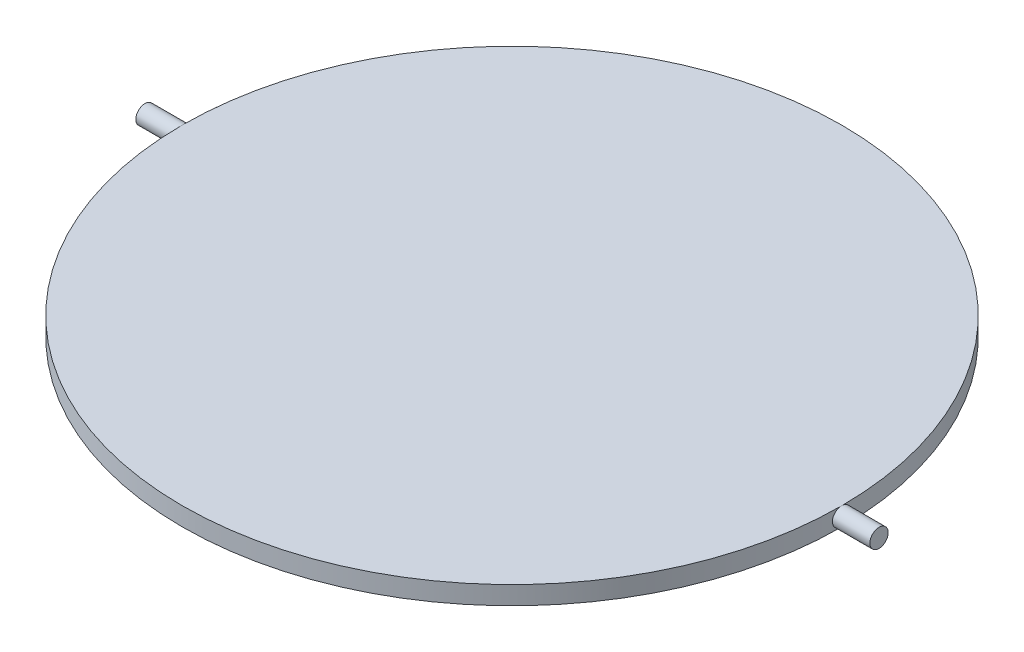
ISO-10303-21;
HEADER;
FILE_DESCRIPTION(('STEP AP214'),'2;1');
FILE_NAME('part.step','',(''),(''),'','','');
FILE_SCHEMA(('AUTOMOTIVE_DESIGN { 1 0 10303 214 1 1 1 1 }'));
ENDSEC;
DATA;
#1=APPLICATION_CONTEXT('core data for automotive mechanical design processes');
#2=APPLICATION_PROTOCOL_DEFINITION('international standard','automotive_design',2000,#1);
#3=PRODUCT_CONTEXT('',#1,'mechanical');
#4=PRODUCT('Part','Part','',(#3));
#5=PRODUCT_RELATED_PRODUCT_CATEGORY('part','',(#4));
#6=PRODUCT_DEFINITION_FORMATION('','',#4);
#7=PRODUCT_DEFINITION_CONTEXT('part definition',#1,'design');
#8=PRODUCT_DEFINITION('design','',#6,#7);
#9=PRODUCT_DEFINITION_SHAPE('','',#8);
#10=(LENGTH_UNIT() NAMED_UNIT(*) SI_UNIT(.MILLI.,.METRE.));
#11=(NAMED_UNIT(*) PLANE_ANGLE_UNIT() SI_UNIT($,.RADIAN.));
#12=(NAMED_UNIT(*) SI_UNIT($,.STERADIAN.) SOLID_ANGLE_UNIT());
#13=UNCERTAINTY_MEASURE_WITH_UNIT(LENGTH_MEASURE(1.E-05),#10,'distance_accuracy_value','');
#14=(GEOMETRIC_REPRESENTATION_CONTEXT(3) GLOBAL_UNCERTAINTY_ASSIGNED_CONTEXT((#13)) GLOBAL_UNIT_ASSIGNED_CONTEXT((#10,
#11,#12)) REPRESENTATION_CONTEXT('',''));
#15=CARTESIAN_POINT('',(0.,0.,0.));
#16=DIRECTION('',(0.,0.,1.));
#17=DIRECTION('',(1.,0.,0.));
#18=AXIS2_PLACEMENT_3D('',#15,#16,#17);
#19=CARTESIAN_POINT('',(0.,0.75,0.));
#20=DIRECTION('',(0.,-1.,0.));
#21=DIRECTION('',(0.,0.,-1.));
#22=AXIS2_PLACEMENT_3D('',#19,#20,#21);
#23=CYLINDRICAL_SURFACE('',#22,26.95);
#24=CARTESIAN_POINT('',(-26.95,0.75,0.));
#25=CARTESIAN_POINT('',(-26.9499998593243,0.749998134870513,-0.0421190802417795));
#26=CARTESIAN_POINT('',(-26.9499002012764,0.74644005737712,-0.0842684931730713));
#27=CARTESIAN_POINT('',(-26.9495122260496,0.732295891268877,-0.167405902207209));
#28=CARTESIAN_POINT('',(-26.9492236832813,0.721701398680808,-0.208392448323906));
#29=CARTESIAN_POINT('',(-26.9484906167634,0.693786775159977,-0.287987679115359));
#30=CARTESIAN_POINT('',(-26.9480461690774,0.676469923524798,-0.326597512573474));
#31=CARTESIAN_POINT('',(-26.9470514315303,0.635606819625647,-0.400351330224189));
#32=CARTESIAN_POINT('',(-26.9465011675827,0.612062091986949,-0.435496159786014));
#33=CARTESIAN_POINT('',(-26.945356507194,0.55940008710365,-0.501347670905925));
#34=CARTESIAN_POINT('',(-26.9447620955323,0.530280882468651,-0.532052810965241));
#35=CARTESIAN_POINT('',(-26.9435962684163,0.467299770399804,-0.588140404970217));
#36=CARTESIAN_POINT('',(-26.9430248538768,0.433437674539571,-0.613522647346801));
#37=CARTESIAN_POINT('',(-26.9419693891428,0.361926751194656,-0.65824597559877));
#38=CARTESIAN_POINT('',(-26.9414853515205,0.324277379991711,-0.677586192412789));
#39=CARTESIAN_POINT('',(-26.9406593539721,0.246264521724114,-0.709670791129391));
#40=CARTESIAN_POINT('',(-26.9403173935157,0.205901044788916,-0.722415197646991));
#41=CARTESIAN_POINT('',(-26.9398142141102,0.123616869284261,-0.740943249359809));
#42=CARTESIAN_POINT('',(-26.9396529480854,0.0816965792477881,-0.746728707575131));
#43=CARTESIAN_POINT('',(-26.9395291991567,-0.00252049162701276,-0.751180217276151));
#44=CARTESIAN_POINT('',(-26.93956671552,-0.0448172710768847,-0.749846295006582));
#45=CARTESIAN_POINT('',(-26.9398362568672,-0.128574368679873,-0.740098448732348));
#46=CARTESIAN_POINT('',(-26.9400682279573,-0.170034915337394,-0.731686486426101));
#47=CARTESIAN_POINT('',(-26.9407004435226,-0.250955140417738,-0.708024377933586));
#48=CARTESIAN_POINT('',(-26.9411006883413,-0.290414814754905,-0.692774217784773));
#49=CARTESIAN_POINT('',(-26.9420243935563,-0.366219476100302,-0.65586636002275));
#50=CARTESIAN_POINT('',(-26.9425478712455,-0.402564024997558,-0.634207763028314));
#51=CARTESIAN_POINT('',(-26.9436590114613,-0.471101931828154,-0.58509851346002));
#52=CARTESIAN_POINT('',(-26.9442466741105,-0.503295281833247,-0.557647849824334));
#53=CARTESIAN_POINT('',(-26.9454201761372,-0.562628370336979,-0.497722591274507));
#54=CARTESIAN_POINT('',(-26.9460060148283,-0.589766390209923,-0.465246294674824));
#55=CARTESIAN_POINT('',(-26.947109633733,-0.638205233371934,-0.396197662688473));
#56=CARTESIAN_POINT('',(-26.947627413936,-0.659506055744256,-0.359625326658515));
#57=CARTESIAN_POINT('',(-26.9485365530528,-0.695665651667148,-0.283421828246701));
#58=CARTESIAN_POINT('',(-26.9489279109162,-0.710524371694971,-0.243790640454293));
#59=CARTESIAN_POINT('',(-26.9495400712508,-0.733376879942729,-0.162594860663954));
#60=CARTESIAN_POINT('',(-26.9497608741226,-0.741370684285609,-0.121030273207049));
#61=CARTESIAN_POINT('',(-26.9500069829467,-0.750264339995218,-0.0371625032931079));
#62=CARTESIAN_POINT('',(-26.9500323544294,-0.751166569254376,0.00514042681967611));
#63=CARTESIAN_POINT('',(-26.9498849139846,-0.745857659629728,0.0892971617452533));
#64=CARTESIAN_POINT('',(-26.9497121022535,-0.739646527793599,0.131150967002983));
#65=CARTESIAN_POINT('',(-26.9491878147197,-0.720289176335919,0.213214739548595));
#66=CARTESIAN_POINT('',(-26.9488363667184,-0.707144035849203,0.253424961577245));
#67=CARTESIAN_POINT('',(-26.9479944123676,-0.674292907708763,0.331067956235496));
#68=CARTESIAN_POINT('',(-26.9475039057801,-0.654586908829557,0.368500724112801));
#69=CARTESIAN_POINT('',(-26.9464389334773,-0.609167323663443,0.439537171027309));
#70=CARTESIAN_POINT('',(-26.9458644454068,-0.583452136692138,0.473139826272216));
#71=CARTESIAN_POINT('',(-26.9446963327876,-0.526746488351254,0.535551907089267));
#72=CARTESIAN_POINT('',(-26.9441027081956,-0.495756015088144,0.564361321854397));
#73=CARTESIAN_POINT('',(-26.9429630579365,-0.429369318250322,0.616377056341489));
#74=CARTESIAN_POINT('',(-26.9424170453299,-0.393971892222208,0.639581841719475));
#75=CARTESIAN_POINT('',(-26.9414343850531,-0.319782245784351,0.679719121093234));
#76=CARTESIAN_POINT('',(-26.9409977371548,-0.280990032457287,0.696651628174721));
#77=CARTESIAN_POINT('',(-26.9402831303949,-0.201117764830667,0.723761013219886));
#78=CARTESIAN_POINT('',(-26.9400051481805,-0.160038048190896,0.733938885389289));
#79=CARTESIAN_POINT('',(-26.9396391487902,-0.0767520810613884,0.747253348822292));
#80=CARTESIAN_POINT('',(-26.9395511315184,-0.0345458311409473,0.750389943644144));
#81=CARTESIAN_POINT('',(-26.9395749942054,0.0497797348292769,0.749532697154204));
#82=CARTESIAN_POINT('',(-26.939686806272,0.0918990755392621,0.745541277592043));
#83=CARTESIAN_POINT('',(-26.9400975801237,0.174869592340975,0.730546280053982));
#84=CARTESIAN_POINT('',(-26.9403965422806,0.215720765912772,0.719542688145376));
#85=CARTESIAN_POINT('',(-26.9411479045594,0.294996354264111,0.69083599262062));
#86=CARTESIAN_POINT('',(-26.9416003073071,0.333420727499004,0.673132774349122));
#87=CARTESIAN_POINT('',(-26.942607530152,0.406751054824806,0.631530298116576));
#88=CARTESIAN_POINT('',(-26.943162346501,0.44165713760727,0.60763126689945));
#89=CARTESIAN_POINT('',(-26.9443120344167,0.506970900716467,0.554308854211107));
#90=CARTESIAN_POINT('',(-26.9449069152961,0.53737752989225,0.524884185486053));
#91=CARTESIAN_POINT('',(-26.9460697277803,0.592827560172211,0.461339143359118));
#92=CARTESIAN_POINT('',(-26.9466376526722,0.617869630709498,0.427217608436631));
#93=CARTESIAN_POINT('',(-26.9476827136046,0.661883370893273,0.355235109991873));
#94=CARTESIAN_POINT('',(-26.9481597927451,0.680851241076937,0.317371825272664));
#95=CARTESIAN_POINT('',(-26.9489683435096,0.7121388261713,0.239026125557905));
#96=CARTESIAN_POINT('',(-26.9492999888072,0.724466474708119,0.198546901127602));
#97=CARTESIAN_POINT('',(-26.9496915938785,0.738854139220878,0.131509714418074));
#98=CARTESIAN_POINT('',(-26.9498067448664,0.743028583802507,0.105386943856878));
#99=CARTESIAN_POINT('',(-26.9499609920539,0.748602099017646,0.0528467632648512));
#100=CARTESIAN_POINT('',(-26.9500000882727,0.750001170352389,0.0264293533084662));
#101=CARTESIAN_POINT('',(-26.95,0.75,0.));
#102=B_SPLINE_CURVE_WITH_KNOTS('',3,(#24,#25,#26,#27,#28,#29,#30,#31,#32,#33,#34,#35,#36,#37,
#38,#39,#40,#41,#42,#43,#44,#45,#46,#47,#48,#49,#50,#51,#52,#53,#54,#55,#56,#57,#58,#59,#60,#61,
#62,#63,#64,#65,#66,#67,#68,#69,#70,#71,#72,#73,#74,#75,#76,#77,#78,#79,#80,#81,#82,#83,#84,#85,
#86,#87,#88,#89,#90,#91,#92,#93,#94,#95,#96,#97,#98,#99,#100,#101),.UNSPECIFIED.,.T.,.F.,(4,2,2,
2,2,2,2,2,2,2,2,2,2,2,2,2,2,2,2,2,2,2,2,2,2,2,2,2,2,2,2,2,2,2,2,2,2,2,4),(0.,0.126260770640131,
0.252672613222269,0.379022866982014,0.505342217944373,0.631705323302165,0.758073450259483,
0.8844597451551,1.01084556838414,1.13719845708141,1.2635508799944,1.38986829551344,
1.51618596895436,1.64252137865089,1.76885702962802,1.8952355519934,2.0216140942068,
2.14799368638754,2.27437298175227,2.40070989877486,2.52704669062722,2.65336382657288,
2.77968117864545,2.90603221665967,3.03238353954563,3.15876941372736,3.28515502423156,
3.41152202807772,3.53788896806532,3.66421298293315,3.79053724879891,3.91686367663714,
4.04318548204608,4.16953675200191,4.29591932456338,4.42238079675801,4.54869083784737,
4.62791838365861,4.70714590945194),.UNSPECIFIED.);
#103=CARTESIAN_POINT('',(-26.95,0.75,0.));
#104=VERTEX_POINT('',#103);
#105=CARTESIAN_POINT('',(-26.95,-0.75,0.));
#106=VERTEX_POINT('',#105);
#107=EDGE_CURVE('E70',#104,#106,#102,.T.);
#108=ORIENTED_EDGE('',*,*,#107,.F.);
#109=CARTESIAN_POINT('',(0.,0.75,0.));
#110=DIRECTION('',(0.,1.,0.));
#111=DIRECTION('',(0.,0.,1.));
#112=AXIS2_PLACEMENT_3D('',#109,#110,#111);
#113=CIRCLE('',#112,26.95);
#114=CARTESIAN_POINT('',(26.95,0.75,0.));
#115=VERTEX_POINT('',#114);
#116=EDGE_CURVE('E11',#115,#104,#113,.T.);
#117=ORIENTED_EDGE('',*,*,#116,.F.);
#118=CARTESIAN_POINT('',(26.95,0.75,0.));
#119=CARTESIAN_POINT('',(26.9499998593243,0.749998134870513,0.0421190802417795));
#120=CARTESIAN_POINT('',(26.9499002012764,0.74644005737712,0.0842684931730713));
#121=CARTESIAN_POINT('',(26.9495122260496,0.732295891268877,0.167405902207209));
#122=CARTESIAN_POINT('',(26.9492236832813,0.721701398680808,0.208392448323906));
#123=CARTESIAN_POINT('',(26.9484906167634,0.693786775159977,0.287987679115359));
#124=CARTESIAN_POINT('',(26.9480461690774,0.676469923524798,0.326597512573474));
#125=CARTESIAN_POINT('',(26.9470514315303,0.635606819625647,0.400351330224189));
#126=CARTESIAN_POINT('',(26.9465011675827,0.612062091986949,0.435496159786014));
#127=CARTESIAN_POINT('',(26.945356507194,0.55940008710365,0.501347670905925));
#128=CARTESIAN_POINT('',(26.9447620955323,0.530280882468651,0.532052810965241));
#129=CARTESIAN_POINT('',(26.9435962684163,0.467299770399804,0.588140404970217));
#130=CARTESIAN_POINT('',(26.9430248538768,0.433437674539571,0.613522647346801));
#131=CARTESIAN_POINT('',(26.9419693891428,0.361926751194656,0.65824597559877));
#132=CARTESIAN_POINT('',(26.9414853515205,0.324277379991711,0.677586192412789));
#133=CARTESIAN_POINT('',(26.9406593539721,0.246264521724114,0.709670791129391));
#134=CARTESIAN_POINT('',(26.9403173935157,0.205901044788916,0.722415197646991));
#135=CARTESIAN_POINT('',(26.9398142141102,0.123616869284261,0.740943249359809));
#136=CARTESIAN_POINT('',(26.9396529480854,0.0816965792477881,0.746728707575131));
#137=CARTESIAN_POINT('',(26.9395291991567,-0.00252049162701276,0.751180217276151));
#138=CARTESIAN_POINT('',(26.93956671552,-0.0448172710768847,0.749846295006582));
#139=CARTESIAN_POINT('',(26.9398362568672,-0.128574368679873,0.740098448732348));
#140=CARTESIAN_POINT('',(26.9400682279573,-0.170034915337394,0.731686486426101));
#141=CARTESIAN_POINT('',(26.9407004435226,-0.250955140417738,0.708024377933586));
#142=CARTESIAN_POINT('',(26.9411006883413,-0.290414814754905,0.692774217784773));
#143=CARTESIAN_POINT('',(26.9420243935563,-0.366219476100302,0.65586636002275));
#144=CARTESIAN_POINT('',(26.9425478712455,-0.402564024997558,0.634207763028314));
#145=CARTESIAN_POINT('',(26.9436590114613,-0.471101931828154,0.58509851346002));
#146=CARTESIAN_POINT('',(26.9442466741105,-0.503295281833247,0.557647849824334));
#147=CARTESIAN_POINT('',(26.9454201761372,-0.562628370336979,0.497722591274507));
#148=CARTESIAN_POINT('',(26.9460060148283,-0.589766390209923,0.465246294674824));
#149=CARTESIAN_POINT('',(26.947109633733,-0.638205233371934,0.396197662688473));
#150=CARTESIAN_POINT('',(26.947627413936,-0.659506055744256,0.359625326658515));
#151=CARTESIAN_POINT('',(26.9485365530528,-0.695665651667148,0.283421828246701));
#152=CARTESIAN_POINT('',(26.9489279109162,-0.710524371694971,0.243790640454293));
#153=CARTESIAN_POINT('',(26.9495400712508,-0.733376879942729,0.162594860663954));
#154=CARTESIAN_POINT('',(26.9497608741226,-0.741370684285609,0.121030273207049));
#155=CARTESIAN_POINT('',(26.9500069829467,-0.750264339995218,0.0371625032931079));
#156=CARTESIAN_POINT('',(26.9500323544294,-0.751166569254376,-0.00514042681967611));
#157=CARTESIAN_POINT('',(26.9498849139846,-0.745857659629728,-0.0892971617452533));
#158=CARTESIAN_POINT('',(26.9497121022535,-0.739646527793599,-0.131150967002983));
#159=CARTESIAN_POINT('',(26.9491878147197,-0.720289176335919,-0.213214739548595));
#160=CARTESIAN_POINT('',(26.9488363667184,-0.707144035849203,-0.253424961577245));
#161=CARTESIAN_POINT('',(26.9479944123676,-0.674292907708763,-0.331067956235496));
#162=CARTESIAN_POINT('',(26.9475039057801,-0.654586908829557,-0.368500724112801));
#163=CARTESIAN_POINT('',(26.9464389334773,-0.609167323663443,-0.439537171027309));
#164=CARTESIAN_POINT('',(26.9458644454068,-0.583452136692138,-0.473139826272216));
#165=CARTESIAN_POINT('',(26.9446963327876,-0.526746488351254,-0.535551907089267));
#166=CARTESIAN_POINT('',(26.9441027081956,-0.495756015088144,-0.564361321854397));
#167=CARTESIAN_POINT('',(26.9429630579365,-0.429369318250322,-0.616377056341489));
#168=CARTESIAN_POINT('',(26.9424170453299,-0.393971892222208,-0.639581841719475));
#169=CARTESIAN_POINT('',(26.9414343850531,-0.319782245784351,-0.679719121093234));
#170=CARTESIAN_POINT('',(26.9409977371548,-0.280990032457287,-0.696651628174721));
#171=CARTESIAN_POINT('',(26.9402831303949,-0.201117764830667,-0.723761013219886));
#172=CARTESIAN_POINT('',(26.9400051481805,-0.160038048190896,-0.733938885389289));
#173=CARTESIAN_POINT('',(26.9396391487902,-0.0767520810613884,-0.747253348822292));
#174=CARTESIAN_POINT('',(26.9395511315184,-0.0345458311409473,-0.750389943644144));
#175=CARTESIAN_POINT('',(26.9395749942054,0.0497797348292769,-0.749532697154204));
#176=CARTESIAN_POINT('',(26.939686806272,0.0918990755392621,-0.745541277592043));
#177=CARTESIAN_POINT('',(26.9400975801237,0.174869592340975,-0.730546280053982));
#178=CARTESIAN_POINT('',(26.9403965422806,0.215720765912772,-0.719542688145376));
#179=CARTESIAN_POINT('',(26.9411479045594,0.294996354264111,-0.69083599262062));
#180=CARTESIAN_POINT('',(26.9416003073071,0.333420727499004,-0.673132774349122));
#181=CARTESIAN_POINT('',(26.942607530152,0.406751054824806,-0.631530298116576));
#182=CARTESIAN_POINT('',(26.943162346501,0.44165713760727,-0.60763126689945));
#183=CARTESIAN_POINT('',(26.9443120344167,0.506970900716467,-0.554308854211107));
#184=CARTESIAN_POINT('',(26.9449069152961,0.53737752989225,-0.524884185486053));
#185=CARTESIAN_POINT('',(26.9460697277803,0.592827560172211,-0.461339143359118));
#186=CARTESIAN_POINT('',(26.9466376526722,0.617869630709498,-0.427217608436631));
#187=CARTESIAN_POINT('',(26.9476827136046,0.661883370893273,-0.355235109991873));
#188=CARTESIAN_POINT('',(26.9481597927451,0.680851241076937,-0.317371825272664));
#189=CARTESIAN_POINT('',(26.9489683435096,0.7121388261713,-0.239026125557905));
#190=CARTESIAN_POINT('',(26.9492999888072,0.724466474708119,-0.198546901127602));
#191=CARTESIAN_POINT('',(26.9496915938785,0.738854139220878,-0.131509714418074));
#192=CARTESIAN_POINT('',(26.9498067448664,0.743028583802507,-0.105386943856878));
#193=CARTESIAN_POINT('',(26.9499609920539,0.748602099017646,-0.0528467632648512));
#194=CARTESIAN_POINT('',(26.9500000882727,0.750001170352389,-0.0264293533084662));
#195=CARTESIAN_POINT('',(26.95,0.75,0.));
#196=B_SPLINE_CURVE_WITH_KNOTS('',3,(#118,#119,#120,#121,#122,#123,#124,#125,#126,#127,#128,
#129,#130,#131,#132,#133,#134,#135,#136,#137,#138,#139,#140,#141,#142,#143,#144,#145,#146,#147,
#148,#149,#150,#151,#152,#153,#154,#155,#156,#157,#158,#159,#160,#161,#162,#163,#164,#165,#166,
#167,#168,#169,#170,#171,#172,#173,#174,#175,#176,#177,#178,#179,#180,#181,#182,#183,#184,#185,
#186,#187,#188,#189,#190,#191,#192,#193,#194,#195),.UNSPECIFIED.,.T.,.F.,(4,2,2,2,2,2,2,2,2,2,2,
2,2,2,2,2,2,2,2,2,2,2,2,2,2,2,2,2,2,2,2,2,2,2,2,2,2,2,4),(0.,0.126260770640131,
0.252672613222269,0.379022866982014,0.505342217944373,0.631705323302165,0.758073450259483,
0.8844597451551,1.01084556838414,1.13719845708141,1.2635508799944,1.38986829551344,
1.51618596895436,1.64252137865089,1.76885702962802,1.8952355519934,2.0216140942068,
2.14799368638754,2.27437298175227,2.40070989877486,2.52704669062722,2.65336382657288,
2.77968117864545,2.90603221665967,3.03238353954563,3.15876941372736,3.28515502423156,
3.41152202807772,3.53788896806532,3.66421298293315,3.79053724879891,3.91686367663714,
4.04318548204608,4.16953675200191,4.29591932456338,4.42238079675801,4.54869083784737,
4.62791838365861,4.70714590945194),.UNSPECIFIED.);
#197=CARTESIAN_POINT('',(26.95,-0.75,0.));
#198=VERTEX_POINT('',#197);
#199=EDGE_CURVE('E63',#198,#115,#196,.T.);
#200=ORIENTED_EDGE('',*,*,#199,.F.);
#201=CARTESIAN_POINT('',(0.,-0.75,0.));
#202=DIRECTION('',(0.,1.,0.));
#203=DIRECTION('',(0.,0.,1.));
#204=AXIS2_PLACEMENT_3D('',#201,#202,#203);
#205=CIRCLE('',#204,26.95);
#206=EDGE_CURVE('E43',#198,#106,#205,.T.);
#207=ORIENTED_EDGE('',*,*,#206,.T.);
#208=EDGE_LOOP('',(#108,#117,#200,#207));
#209=FACE_BOUND('',#208,.T.);
#210=ADVANCED_FACE('F39',(#209),#23,.T.);
#211=EDGE_CURVE('E55',#106,#104,#102,.T.);
#212=ORIENTED_EDGE('',*,*,#211,.F.);
#213=EDGE_CURVE('E77',#106,#198,#205,.T.);
#214=ORIENTED_EDGE('',*,*,#213,.T.);
#215=EDGE_CURVE('E75',#115,#198,#196,.T.);
#216=ORIENTED_EDGE('',*,*,#215,.F.);
#217=EDGE_CURVE('E48',#104,#115,#113,.T.);
#218=ORIENTED_EDGE('',*,*,#217,.F.);
#219=EDGE_LOOP('',(#212,#214,#216,#218));
#220=FACE_BOUND('',#219,.T.);
#221=ADVANCED_FACE('F76',(#220),#23,.T.);
#222=CARTESIAN_POINT('',(0.,0.75,0.));
#223=DIRECTION('',(0.,1.,0.));
#224=DIRECTION('',(0.,0.,1.));
#225=AXIS2_PLACEMENT_3D('',#222,#223,#224);
#226=PLANE('',#225);
#227=ORIENTED_EDGE('',*,*,#217,.T.);
#228=ORIENTED_EDGE('',*,*,#116,.T.);
#229=EDGE_LOOP('',(#227,#228));
#230=FACE_BOUND('',#229,.T.);
#231=ADVANCED_FACE('F73',(#230),#226,.T.);
#232=CARTESIAN_POINT('',(0.,-0.75,0.));
#233=DIRECTION('',(0.,1.,0.));
#234=DIRECTION('',(0.,0.,1.));
#235=AXIS2_PLACEMENT_3D('',#232,#233,#234);
#236=PLANE('',#235);
#237=ORIENTED_EDGE('',*,*,#213,.F.);
#238=ORIENTED_EDGE('',*,*,#206,.F.);
#239=EDGE_LOOP('',(#237,#238));
#240=FACE_BOUND('',#239,.T.);
#241=ADVANCED_FACE('F105',(#240),#236,.F.);
#242=CARTESIAN_POINT('',(30.,0.,0.));
#243=DIRECTION('',(1.,0.,0.));
#244=DIRECTION('',(0.,0.,-1.));
#245=AXIS2_PLACEMENT_3D('',#242,#243,#244);
#246=PLANE('',#245);
#247=CARTESIAN_POINT('',(30.,0.,0.));
#248=DIRECTION('',(1.,0.,0.));
#249=DIRECTION('',(0.,0.,-1.));
#250=AXIS2_PLACEMENT_3D('',#247,#248,#249);
#251=CIRCLE('',#250,0.75);
#252=CARTESIAN_POINT('',(30.,0.,-0.75));
#253=VERTEX_POINT('',#252);
#254=EDGE_CURVE('E82',#253,#253,#251,.T.);
#255=ORIENTED_EDGE('',*,*,#254,.T.);
#256=EDGE_LOOP('',(#255));
#257=FACE_BOUND('',#256,.T.);
#258=ADVANCED_FACE('F107',(#257),#246,.T.);
#259=CARTESIAN_POINT('',(30.,0.,0.));
#260=DIRECTION('',(-1.,0.,0.));
#261=DIRECTION('',(0.,0.,1.));
#262=AXIS2_PLACEMENT_3D('',#259,#260,#261);
#263=CYLINDRICAL_SURFACE('',#262,0.75);
#264=ORIENTED_EDGE('',*,*,#254,.F.);
#265=EDGE_LOOP('',(#264));
#266=FACE_BOUND('',#265,.T.);
#267=ORIENTED_EDGE('',*,*,#199,.T.);
#268=ORIENTED_EDGE('',*,*,#215,.T.);
#269=EDGE_LOOP('',(#267,#268));
#270=FACE_BOUND('',#269,.T.);
#271=ADVANCED_FACE('F81',(#266,#270),#263,.T.);
#272=CARTESIAN_POINT('',(-30.,0.,0.));
#273=DIRECTION('',(1.,0.,0.));
#274=DIRECTION('',(0.,0.,-1.));
#275=AXIS2_PLACEMENT_3D('',#272,#273,#274);
#276=CIRCLE('',#275,0.75);
#277=CARTESIAN_POINT('',(-30.,0.,-0.75));
#278=VERTEX_POINT('',#277);
#279=EDGE_CURVE('E84',#278,#278,#276,.T.);
#280=ORIENTED_EDGE('',*,*,#279,.T.);
#281=EDGE_LOOP('',(#280));
#282=FACE_BOUND('',#281,.T.);
#283=ORIENTED_EDGE('',*,*,#211,.T.);
#284=ORIENTED_EDGE('',*,*,#107,.T.);
#285=EDGE_LOOP('',(#283,#284));
#286=FACE_BOUND('',#285,.T.);
#287=ADVANCED_FACE('F95',(#282,#286),#263,.T.);
#288=CARTESIAN_POINT('',(-30.,0.,0.));
#289=DIRECTION('',(1.,0.,0.));
#290=DIRECTION('',(0.,0.,-1.));
#291=AXIS2_PLACEMENT_3D('',#288,#289,#290);
#292=PLANE('',#291);
#293=ORIENTED_EDGE('',*,*,#279,.F.);
#294=EDGE_LOOP('',(#293));
#295=FACE_BOUND('',#294,.T.);
#296=ADVANCED_FACE('F100',(#295),#292,.F.);
#297=CLOSED_SHELL('',(#210,#221,#231,#241,#258,#271,#287,#296));
#298=MANIFOLD_SOLID_BREP('B2',#297);
#299=ADVANCED_BREP_SHAPE_REPRESENTATION('',(#18,#298),#14);
#300=SHAPE_DEFINITION_REPRESENTATION(#9,#299);
ENDSEC;
END-ISO-10303-21;
